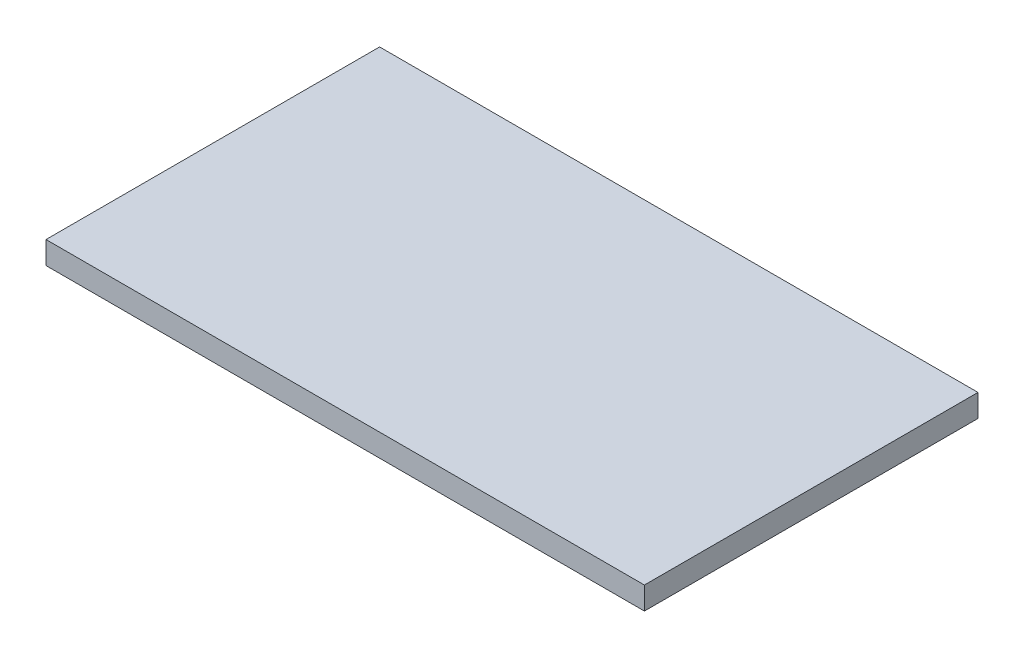
ISO-10303-21;
HEADER;
FILE_DESCRIPTION(('STEP AP214'),'2;1');
FILE_NAME('part.step','',(''),(''),'','','');
FILE_SCHEMA(('AUTOMOTIVE_DESIGN { 1 0 10303 214 1 1 1 1 }'));
ENDSEC;
DATA;
#1=APPLICATION_CONTEXT('core data for automotive mechanical design processes');
#2=APPLICATION_PROTOCOL_DEFINITION('international standard','automotive_design',2000,#1);
#3=PRODUCT_CONTEXT('',#1,'mechanical');
#4=PRODUCT('Part','Part','',(#3));
#5=PRODUCT_RELATED_PRODUCT_CATEGORY('part','',(#4));
#6=PRODUCT_DEFINITION_FORMATION('','',#4);
#7=PRODUCT_DEFINITION_CONTEXT('part definition',#1,'design');
#8=PRODUCT_DEFINITION('design','',#6,#7);
#9=PRODUCT_DEFINITION_SHAPE('','',#8);
#10=(LENGTH_UNIT() NAMED_UNIT(*) SI_UNIT(.MILLI.,.METRE.));
#11=(NAMED_UNIT(*) PLANE_ANGLE_UNIT() SI_UNIT($,.RADIAN.));
#12=(NAMED_UNIT(*) SI_UNIT($,.STERADIAN.) SOLID_ANGLE_UNIT());
#13=UNCERTAINTY_MEASURE_WITH_UNIT(LENGTH_MEASURE(1.E-05),#10,'distance_accuracy_value','');
#14=(GEOMETRIC_REPRESENTATION_CONTEXT(3) GLOBAL_UNCERTAINTY_ASSIGNED_CONTEXT((#13)) GLOBAL_UNIT_ASSIGNED_CONTEXT((#10,
#11,#12)) REPRESENTATION_CONTEXT('',''));
#15=CARTESIAN_POINT('',(0.,0.,0.));
#16=DIRECTION('',(0.,0.,1.));
#17=DIRECTION('',(1.,0.,0.));
#18=AXIS2_PLACEMENT_3D('',#15,#16,#17);
#19=CARTESIAN_POINT('',(74.041,5.588,41.275));
#20=DIRECTION('',(-1.,0.,0.));
#21=DIRECTION('',(0.,0.,1.));
#22=AXIS2_PLACEMENT_3D('',#19,#20,#21);
#23=PLANE('',#22);
#24=DIRECTION('',(0.,0.,-1.));
#25=VECTOR('',#24,1.);
#26=CARTESIAN_POINT('',(74.041,0.,41.275));
#27=LINE('',#26,#25);
#28=CARTESIAN_POINT('',(74.041,0.,41.275));
#29=VERTEX_POINT('',#28);
#30=CARTESIAN_POINT('',(74.041,0.,-41.275));
#31=VERTEX_POINT('',#30);
#32=EDGE_CURVE('E100',#29,#31,#27,.T.);
#33=ORIENTED_EDGE('',*,*,#32,.T.);
#34=DIRECTION('',(0.,-1.,0.));
#35=VECTOR('',#34,1.);
#36=CARTESIAN_POINT('',(74.041,5.588,-41.275));
#37=LINE('',#36,#35);
#38=CARTESIAN_POINT('',(74.041,5.588,-41.275));
#39=VERTEX_POINT('',#38);
#40=EDGE_CURVE('E11',#39,#31,#37,.T.);
#41=ORIENTED_EDGE('',*,*,#40,.F.);
#42=DIRECTION('',(0.,0.,-1.));
#43=VECTOR('',#42,1.);
#44=CARTESIAN_POINT('',(74.041,5.588,41.275));
#45=LINE('',#44,#43);
#46=CARTESIAN_POINT('',(74.041,5.588,41.275));
#47=VERTEX_POINT('',#46);
#48=EDGE_CURVE('E88',#47,#39,#45,.T.);
#49=ORIENTED_EDGE('',*,*,#48,.F.);
#50=DIRECTION('',(0.,-1.,0.));
#51=VECTOR('',#50,1.);
#52=CARTESIAN_POINT('',(74.041,5.588,41.275));
#53=LINE('',#52,#51);
#54=EDGE_CURVE('E96',#47,#29,#53,.T.);
#55=ORIENTED_EDGE('',*,*,#54,.T.);
#56=EDGE_LOOP('',(#33,#41,#49,#55));
#57=FACE_BOUND('',#56,.T.);
#58=ADVANCED_FACE('F37',(#57),#23,.F.);
#59=CARTESIAN_POINT('',(-74.041,5.588,-41.275));
#60=DIRECTION('',(0.,0.,1.));
#61=DIRECTION('',(1.,0.,0.));
#62=AXIS2_PLACEMENT_3D('',#59,#60,#61);
#63=PLANE('',#62);
#64=DIRECTION('',(-1.,0.,0.));
#65=VECTOR('',#64,1.);
#66=CARTESIAN_POINT('',(-74.041,0.,-41.275));
#67=LINE('',#66,#65);
#68=CARTESIAN_POINT('',(-74.041,0.,-41.275));
#69=VERTEX_POINT('',#68);
#70=EDGE_CURVE('E92',#31,#69,#67,.T.);
#71=ORIENTED_EDGE('',*,*,#70,.T.);
#72=DIRECTION('',(0.,-1.,0.));
#73=VECTOR('',#72,1.);
#74=CARTESIAN_POINT('',(-74.041,5.588,-41.275));
#75=LINE('',#74,#73);
#76=CARTESIAN_POINT('',(-74.041,5.588,-41.275));
#77=VERTEX_POINT('',#76);
#78=EDGE_CURVE('E45',#77,#69,#75,.T.);
#79=ORIENTED_EDGE('',*,*,#78,.F.);
#80=DIRECTION('',(-1.,0.,0.));
#81=VECTOR('',#80,1.);
#82=CARTESIAN_POINT('',(-74.041,5.588,-41.275));
#83=LINE('',#82,#81);
#84=EDGE_CURVE('E83',#39,#77,#83,.T.);
#85=ORIENTED_EDGE('',*,*,#84,.F.);
#86=ORIENTED_EDGE('',*,*,#40,.T.);
#87=EDGE_LOOP('',(#71,#79,#85,#86));
#88=FACE_BOUND('',#87,.T.);
#89=ADVANCED_FACE('F91',(#88),#63,.F.);
#90=CARTESIAN_POINT('',(-74.041,5.588,41.275));
#91=DIRECTION('',(1.,0.,0.));
#92=DIRECTION('',(0.,0.,-1.));
#93=AXIS2_PLACEMENT_3D('',#90,#91,#92);
#94=PLANE('',#93);
#95=DIRECTION('',(0.,0.,1.));
#96=VECTOR('',#95,1.);
#97=CARTESIAN_POINT('',(-74.041,0.,41.275));
#98=LINE('',#97,#96);
#99=CARTESIAN_POINT('',(-74.041,0.,41.275));
#100=VERTEX_POINT('',#99);
#101=EDGE_CURVE('E70',#69,#100,#98,.T.);
#102=ORIENTED_EDGE('',*,*,#101,.T.);
#103=DIRECTION('',(0.,-1.,0.));
#104=VECTOR('',#103,1.);
#105=CARTESIAN_POINT('',(-74.041,5.588,41.275));
#106=LINE('',#105,#104);
#107=CARTESIAN_POINT('',(-74.041,5.588,41.275));
#108=VERTEX_POINT('',#107);
#109=EDGE_CURVE('E93',#108,#100,#106,.T.);
#110=ORIENTED_EDGE('',*,*,#109,.F.);
#111=DIRECTION('',(0.,0.,1.));
#112=VECTOR('',#111,1.);
#113=CARTESIAN_POINT('',(-74.041,5.588,41.275));
#114=LINE('',#113,#112);
#115=EDGE_CURVE('E86',#77,#108,#114,.T.);
#116=ORIENTED_EDGE('',*,*,#115,.F.);
#117=ORIENTED_EDGE('',*,*,#78,.T.);
#118=EDGE_LOOP('',(#102,#110,#116,#117));
#119=FACE_BOUND('',#118,.T.);
#120=ADVANCED_FACE('F94',(#119),#94,.F.);
#121=CARTESIAN_POINT('',(-74.041,5.588,41.275));
#122=DIRECTION('',(0.,0.,-1.));
#123=DIRECTION('',(-1.,0.,0.));
#124=AXIS2_PLACEMENT_3D('',#121,#122,#123);
#125=PLANE('',#124);
#126=DIRECTION('',(1.,0.,0.));
#127=VECTOR('',#126,1.);
#128=CARTESIAN_POINT('',(-74.041,0.,41.275));
#129=LINE('',#128,#127);
#130=EDGE_CURVE('E76',#100,#29,#129,.T.);
#131=ORIENTED_EDGE('',*,*,#130,.T.);
#132=ORIENTED_EDGE('',*,*,#54,.F.);
#133=DIRECTION('',(1.,0.,0.));
#134=VECTOR('',#133,1.);
#135=CARTESIAN_POINT('',(-74.041,5.588,41.275));
#136=LINE('',#135,#134);
#137=EDGE_CURVE('E53',#108,#47,#136,.T.);
#138=ORIENTED_EDGE('',*,*,#137,.F.);
#139=ORIENTED_EDGE('',*,*,#109,.T.);
#140=EDGE_LOOP('',(#131,#132,#138,#139));
#141=FACE_BOUND('',#140,.T.);
#142=ADVANCED_FACE('F107',(#141),#125,.F.);
#143=CARTESIAN_POINT('',(0.,5.588,0.));
#144=DIRECTION('',(0.,-1.,0.));
#145=DIRECTION('',(0.,0.,-1.));
#146=AXIS2_PLACEMENT_3D('',#143,#144,#145);
#147=PLANE('',#146);
#148=ORIENTED_EDGE('',*,*,#48,.T.);
#149=ORIENTED_EDGE('',*,*,#84,.T.);
#150=ORIENTED_EDGE('',*,*,#115,.T.);
#151=ORIENTED_EDGE('',*,*,#137,.T.);
#152=EDGE_LOOP('',(#148,#149,#150,#151));
#153=FACE_BOUND('',#152,.T.);
#154=ADVANCED_FACE('F84',(#153),#147,.F.);
#155=CARTESIAN_POINT('',(0.,0.,0.));
#156=DIRECTION('',(0.,-1.,0.));
#157=DIRECTION('',(0.,0.,-1.));
#158=AXIS2_PLACEMENT_3D('',#155,#156,#157);
#159=PLANE('',#158);
#160=ORIENTED_EDGE('',*,*,#32,.F.);
#161=ORIENTED_EDGE('',*,*,#130,.F.);
#162=ORIENTED_EDGE('',*,*,#101,.F.);
#163=ORIENTED_EDGE('',*,*,#70,.F.);
#164=EDGE_LOOP('',(#160,#161,#162,#163));
#165=FACE_BOUND('',#164,.T.);
#166=ADVANCED_FACE('F110',(#165),#159,.T.);
#167=CLOSED_SHELL('',(#58,#89,#120,#142,#154,#166));
#168=MANIFOLD_SOLID_BREP('B2',#167);
#169=ADVANCED_BREP_SHAPE_REPRESENTATION('',(#18,#168),#14);
#170=SHAPE_DEFINITION_REPRESENTATION(#9,#169);
ENDSEC;
END-ISO-10303-21;
